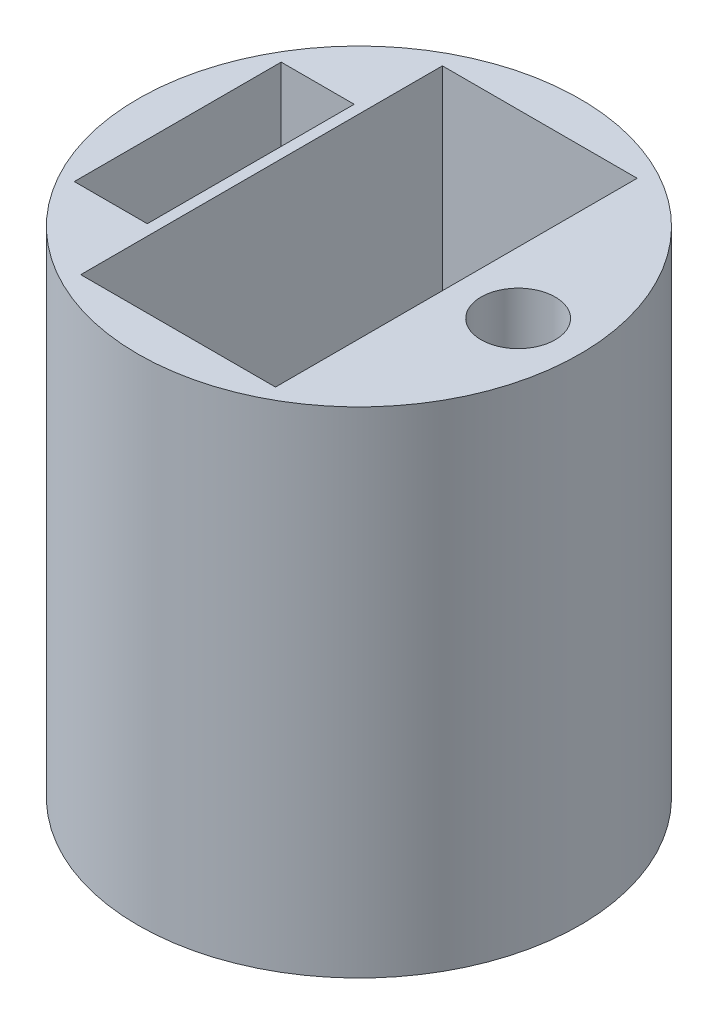
ISO-10303-21;
HEADER;
FILE_DESCRIPTION(('STEP AP214'),'2;1');
FILE_NAME('part.step','',(''),(''),'','','');
FILE_SCHEMA(('AUTOMOTIVE_DESIGN { 1 0 10303 214 1 1 1 1 }'));
ENDSEC;
DATA;
#1=APPLICATION_CONTEXT('core data for automotive mechanical design processes');
#2=APPLICATION_PROTOCOL_DEFINITION('international standard','automotive_design',2000,#1);
#3=PRODUCT_CONTEXT('',#1,'mechanical');
#4=PRODUCT('Part','Part','',(#3));
#5=PRODUCT_RELATED_PRODUCT_CATEGORY('part','',(#4));
#6=PRODUCT_DEFINITION_FORMATION('','',#4);
#7=PRODUCT_DEFINITION_CONTEXT('part definition',#1,'design');
#8=PRODUCT_DEFINITION('design','',#6,#7);
#9=PRODUCT_DEFINITION_SHAPE('','',#8);
#10=(LENGTH_UNIT() NAMED_UNIT(*) SI_UNIT(.MILLI.,.METRE.));
#11=(NAMED_UNIT(*) PLANE_ANGLE_UNIT() SI_UNIT($,.RADIAN.));
#12=(NAMED_UNIT(*) SI_UNIT($,.STERADIAN.) SOLID_ANGLE_UNIT());
#13=UNCERTAINTY_MEASURE_WITH_UNIT(LENGTH_MEASURE(1.E-05),#10,'distance_accuracy_value','');
#14=(GEOMETRIC_REPRESENTATION_CONTEXT(3) GLOBAL_UNCERTAINTY_ASSIGNED_CONTEXT((#13)) GLOBAL_UNIT_ASSIGNED_CONTEXT((#10,
#11,#12)) REPRESENTATION_CONTEXT('',''));
#15=CARTESIAN_POINT('',(0.,0.,0.));
#16=DIRECTION('',(0.,0.,1.));
#17=DIRECTION('',(1.,0.,0.));
#18=AXIS2_PLACEMENT_3D('',#15,#16,#17);
#19=CARTESIAN_POINT('',(0.,203.2,0.));
#20=DIRECTION('',(0.,-1.,0.));
#21=DIRECTION('',(0.,0.,-1.));
#22=AXIS2_PLACEMENT_3D('',#19,#20,#21);
#23=CYLINDRICAL_SURFACE('',#22,90.805);
#24=CARTESIAN_POINT('',(0.,203.2,0.));
#25=DIRECTION('',(0.,1.,0.));
#26=DIRECTION('',(0.,0.,1.));
#27=AXIS2_PLACEMENT_3D('',#24,#25,#26);
#28=CIRCLE('',#27,90.805);
#29=CARTESIAN_POINT('',(0.,203.2,90.805));
#30=VERTEX_POINT('',#29);
#31=EDGE_CURVE('E161',#30,#30,#28,.T.);
#32=ORIENTED_EDGE('',*,*,#31,.F.);
#33=EDGE_LOOP('',(#32));
#34=FACE_BOUND('',#33,.T.);
#35=CARTESIAN_POINT('',(0.,0.,0.));
#36=DIRECTION('',(0.,1.,0.));
#37=DIRECTION('',(0.,0.,1.));
#38=AXIS2_PLACEMENT_3D('',#35,#36,#37);
#39=CIRCLE('',#38,90.805);
#40=CARTESIAN_POINT('',(0.,0.,90.805));
#41=VERTEX_POINT('',#40);
#42=EDGE_CURVE('E154',#41,#41,#39,.T.);
#43=ORIENTED_EDGE('',*,*,#42,.T.);
#44=EDGE_LOOP('',(#43));
#45=FACE_BOUND('',#44,.T.);
#46=ADVANCED_FACE('F33',(#34,#45),#23,.T.);
#47=CARTESIAN_POINT('',(0.,203.2,0.));
#48=DIRECTION('',(0.,1.,0.));
#49=DIRECTION('',(0.,0.,1.));
#50=AXIS2_PLACEMENT_3D('',#47,#48,#49);
#51=PLANE('',#50);
#52=CARTESIAN_POINT('',(65.405,203.2,0.));
#53=DIRECTION('',(0.,1.,0.));
#54=DIRECTION('',(0.,0.,1.));
#55=AXIS2_PLACEMENT_3D('',#52,#53,#54);
#56=CIRCLE('',#55,15.24);
#57=CARTESIAN_POINT('',(65.405,203.2,15.24));
#58=VERTEX_POINT('',#57);
#59=EDGE_CURVE('E233',#58,#58,#56,.T.);
#60=ORIENTED_EDGE('',*,*,#59,.F.);
#61=EDGE_LOOP('',(#60));
#62=FACE_BOUND('',#61,.T.);
#63=DIRECTION('',(0.,0.,1.));
#64=VECTOR('',#63,1.);
#65=CARTESIAN_POINT('',(-74.45,203.2,-42.5));
#66=LINE('',#65,#64);
#67=CARTESIAN_POINT('',(-74.45,203.2,-42.5));
#68=VERTEX_POINT('',#67);
#69=CARTESIAN_POINT('',(-74.45,203.2,42.5));
#70=VERTEX_POINT('',#69);
#71=EDGE_CURVE('E54',#68,#70,#66,.T.);
#72=ORIENTED_EDGE('',*,*,#71,.F.);
#73=DIRECTION('',(-1.,0.,0.));
#74=VECTOR('',#73,1.);
#75=CARTESIAN_POINT('',(-74.45,203.2,-42.5));
#76=LINE('',#75,#74);
#77=CARTESIAN_POINT('',(-44.45,203.2,-42.5));
#78=VERTEX_POINT('',#77);
#79=EDGE_CURVE('E245',#78,#68,#76,.T.);
#80=ORIENTED_EDGE('',*,*,#79,.F.);
#81=DIRECTION('',(0.,0.,-1.));
#82=VECTOR('',#81,1.);
#83=CARTESIAN_POINT('',(-44.45,203.2,-42.5));
#84=LINE('',#83,#82);
#85=CARTESIAN_POINT('',(-44.45,203.2,42.5));
#86=VERTEX_POINT('',#85);
#87=EDGE_CURVE('E258',#86,#78,#84,.T.);
#88=ORIENTED_EDGE('',*,*,#87,.F.);
#89=DIRECTION('',(1.,0.,0.));
#90=VECTOR('',#89,1.);
#91=CARTESIAN_POINT('',(-74.45,203.2,42.5));
#92=LINE('',#91,#90);
#93=EDGE_CURVE('E255',#70,#86,#92,.T.);
#94=ORIENTED_EDGE('',*,*,#93,.F.);
#95=EDGE_LOOP('',(#72,#80,#88,#94));
#96=FACE_BOUND('',#95,.T.);
#97=DIRECTION('',(0.,0.,1.));
#98=VECTOR('',#97,1.);
#99=CARTESIAN_POINT('',(-40.005,203.2,-74.295));
#100=LINE('',#99,#98);
#101=CARTESIAN_POINT('',(-40.005,203.2,-74.295));
#102=VERTEX_POINT('',#101);
#103=CARTESIAN_POINT('',(-40.005,203.2,74.295));
#104=VERTEX_POINT('',#103);
#105=EDGE_CURVE('E141',#102,#104,#100,.T.);
#106=ORIENTED_EDGE('',*,*,#105,.F.);
#107=DIRECTION('',(-1.,0.,0.));
#108=VECTOR('',#107,1.);
#109=CARTESIAN_POINT('',(40.005,203.2,-74.295));
#110=LINE('',#109,#108);
#111=CARTESIAN_POINT('',(40.005,203.2,-74.295));
#112=VERTEX_POINT('',#111);
#113=EDGE_CURVE('E133',#112,#102,#110,.T.);
#114=ORIENTED_EDGE('',*,*,#113,.F.);
#115=DIRECTION('',(0.,0.,-1.));
#116=VECTOR('',#115,1.);
#117=CARTESIAN_POINT('',(40.005,203.2,-74.295));
#118=LINE('',#117,#116);
#119=CARTESIAN_POINT('',(40.005,203.2,74.295));
#120=VERTEX_POINT('',#119);
#121=EDGE_CURVE('E147',#120,#112,#118,.T.);
#122=ORIENTED_EDGE('',*,*,#121,.F.);
#123=DIRECTION('',(1.,0.,0.));
#124=VECTOR('',#123,1.);
#125=CARTESIAN_POINT('',(40.005,203.2,74.295));
#126=LINE('',#125,#124);
#127=EDGE_CURVE('E143',#104,#120,#126,.T.);
#128=ORIENTED_EDGE('',*,*,#127,.F.);
#129=EDGE_LOOP('',(#106,#114,#122,#128));
#130=FACE_BOUND('',#129,.T.);
#131=ORIENTED_EDGE('',*,*,#31,.T.);
#132=EDGE_LOOP('',(#131));
#133=FACE_BOUND('',#132,.T.);
#134=ADVANCED_FACE('F180',(#62,#96,#130,#133),#51,.T.);
#135=CARTESIAN_POINT('',(0.,0.,0.));
#136=DIRECTION('',(0.,1.,0.));
#137=DIRECTION('',(0.,0.,1.));
#138=AXIS2_PLACEMENT_3D('',#135,#136,#137);
#139=PLANE('',#138);
#140=CARTESIAN_POINT('',(65.405,0.,0.));
#141=DIRECTION('',(0.,1.,0.));
#142=DIRECTION('',(0.,0.,1.));
#143=AXIS2_PLACEMENT_3D('',#140,#141,#142);
#144=CIRCLE('',#143,15.24);
#145=CARTESIAN_POINT('',(65.405,0.,15.24));
#146=VERTEX_POINT('',#145);
#147=EDGE_CURVE('E236',#146,#146,#144,.F.);
#148=ORIENTED_EDGE('',*,*,#147,.F.);
#149=EDGE_LOOP('',(#148));
#150=FACE_BOUND('',#149,.T.);
#151=DIRECTION('',(0.,0.,1.));
#152=VECTOR('',#151,1.);
#153=CARTESIAN_POINT('',(-40.005,0.,-74.295));
#154=LINE('',#153,#152);
#155=CARTESIAN_POINT('',(-40.005,0.,-74.295));
#156=VERTEX_POINT('',#155);
#157=CARTESIAN_POINT('',(-40.005,0.,-3.98415720990258));
#158=VERTEX_POINT('',#157);
#159=EDGE_CURVE('E119',#156,#158,#154,.T.);
#160=ORIENTED_EDGE('',*,*,#159,.T.);
#161=CARTESIAN_POINT('',(-53.34,0.,3.39387606462255));
#162=DIRECTION('',(0.,-1.,0.));
#163=DIRECTION('',(0.,0.,-1.));
#164=AXIS2_PLACEMENT_3D('',#161,#162,#163);
#165=CIRCLE('',#164,15.24);
#166=CARTESIAN_POINT('',(-40.005,0.,10.7719093391477));
#167=VERTEX_POINT('',#166);
#168=EDGE_CURVE('E108',#167,#158,#165,.T.);
#169=ORIENTED_EDGE('',*,*,#168,.F.);
#170=CARTESIAN_POINT('',(-40.005,0.,74.295));
#171=VERTEX_POINT('',#170);
#172=EDGE_CURVE('E128',#167,#171,#154,.T.);
#173=ORIENTED_EDGE('',*,*,#172,.T.);
#174=DIRECTION('',(1.,0.,0.));
#175=VECTOR('',#174,1.);
#176=CARTESIAN_POINT('',(40.005,0.,74.295));
#177=LINE('',#176,#175);
#178=CARTESIAN_POINT('',(40.005,0.,74.295));
#179=VERTEX_POINT('',#178);
#180=EDGE_CURVE('E127',#171,#179,#177,.T.);
#181=ORIENTED_EDGE('',*,*,#180,.T.);
#182=DIRECTION('',(0.,0.,-1.));
#183=VECTOR('',#182,1.);
#184=CARTESIAN_POINT('',(40.005,0.,-74.295));
#185=LINE('',#184,#183);
#186=CARTESIAN_POINT('',(40.005,0.,-74.295));
#187=VERTEX_POINT('',#186);
#188=EDGE_CURVE('E131',#179,#187,#185,.T.);
#189=ORIENTED_EDGE('',*,*,#188,.T.);
#190=DIRECTION('',(-1.,0.,0.));
#191=VECTOR('',#190,1.);
#192=CARTESIAN_POINT('',(40.005,0.,-74.295));
#193=LINE('',#192,#191);
#194=EDGE_CURVE('E126',#187,#156,#193,.T.);
#195=ORIENTED_EDGE('',*,*,#194,.T.);
#196=EDGE_LOOP('',(#160,#169,#173,#181,#189,#195));
#197=FACE_BOUND('',#196,.T.);
#198=ORIENTED_EDGE('',*,*,#42,.F.);
#199=EDGE_LOOP('',(#198));
#200=FACE_BOUND('',#199,.T.);
#201=ADVANCED_FACE('F122',(#150,#197,#200),#139,.F.);
#202=CARTESIAN_POINT('',(-40.005,0.,-74.295));
#203=DIRECTION('',(-1.,0.,0.));
#204=DIRECTION('',(0.,0.,1.));
#205=AXIS2_PLACEMENT_3D('',#202,#203,#204);
#206=PLANE('',#205);
#207=DIRECTION('',(0.,0.,1.));
#208=VECTOR('',#207,1.);
#209=CARTESIAN_POINT('',(-40.005,63.5,-74.295));
#210=LINE('',#209,#208);
#211=CARTESIAN_POINT('',(-40.005,63.5,-3.98415720990258));
#212=VERTEX_POINT('',#211);
#213=CARTESIAN_POINT('',(-40.005,63.5,10.7719093391477));
#214=VERTEX_POINT('',#213);
#215=EDGE_CURVE('E121',#212,#214,#210,.T.);
#216=ORIENTED_EDGE('',*,*,#215,.F.);
#217=DIRECTION('',(0.,-1.,0.));
#218=VECTOR('',#217,1.);
#219=CARTESIAN_POINT('',(-40.005,63.5,-3.98415720990258));
#220=LINE('',#219,#218);
#221=EDGE_CURVE('E11',#212,#158,#220,.T.);
#222=ORIENTED_EDGE('',*,*,#221,.T.);
#223=ORIENTED_EDGE('',*,*,#159,.F.);
#224=DIRECTION('',(0.,1.,0.));
#225=VECTOR('',#224,1.);
#226=CARTESIAN_POINT('',(-40.005,0.,-74.295));
#227=LINE('',#226,#225);
#228=EDGE_CURVE('E152',#156,#102,#227,.T.);
#229=ORIENTED_EDGE('',*,*,#228,.T.);
#230=ORIENTED_EDGE('',*,*,#105,.T.);
#231=DIRECTION('',(0.,1.,0.));
#232=VECTOR('',#231,1.);
#233=CARTESIAN_POINT('',(-40.005,0.,74.295));
#234=LINE('',#233,#232);
#235=EDGE_CURVE('E140',#171,#104,#234,.T.);
#236=ORIENTED_EDGE('',*,*,#235,.F.);
#237=ORIENTED_EDGE('',*,*,#172,.F.);
#238=DIRECTION('',(0.,-1.,0.));
#239=VECTOR('',#238,1.);
#240=CARTESIAN_POINT('',(-40.005,63.5,10.7719093391477));
#241=LINE('',#240,#239);
#242=EDGE_CURVE('E40',#167,#214,#241,.F.);
#243=ORIENTED_EDGE('',*,*,#242,.T.);
#244=EDGE_LOOP('',(#216,#222,#223,#229,#230,#236,#237,#243));
#245=FACE_BOUND('',#244,.T.);
#246=ADVANCED_FACE('F118',(#245),#206,.F.);
#247=CARTESIAN_POINT('',(40.005,0.,-74.295));
#248=DIRECTION('',(0.,0.,-1.));
#249=DIRECTION('',(-1.,0.,0.));
#250=AXIS2_PLACEMENT_3D('',#247,#248,#249);
#251=PLANE('',#250);
#252=ORIENTED_EDGE('',*,*,#113,.T.);
#253=ORIENTED_EDGE('',*,*,#228,.F.);
#254=ORIENTED_EDGE('',*,*,#194,.F.);
#255=DIRECTION('',(0.,1.,0.));
#256=VECTOR('',#255,1.);
#257=CARTESIAN_POINT('',(40.005,0.,-74.295));
#258=LINE('',#257,#256);
#259=EDGE_CURVE('E155',#187,#112,#258,.T.);
#260=ORIENTED_EDGE('',*,*,#259,.T.);
#261=EDGE_LOOP('',(#252,#253,#254,#260));
#262=FACE_BOUND('',#261,.T.);
#263=ADVANCED_FACE('F177',(#262),#251,.F.);
#264=CARTESIAN_POINT('',(40.005,0.,-74.295));
#265=DIRECTION('',(1.,0.,0.));
#266=DIRECTION('',(0.,0.,-1.));
#267=AXIS2_PLACEMENT_3D('',#264,#265,#266);
#268=PLANE('',#267);
#269=ORIENTED_EDGE('',*,*,#121,.T.);
#270=ORIENTED_EDGE('',*,*,#259,.F.);
#271=ORIENTED_EDGE('',*,*,#188,.F.);
#272=DIRECTION('',(0.,1.,0.));
#273=VECTOR('',#272,1.);
#274=CARTESIAN_POINT('',(40.005,0.,74.295));
#275=LINE('',#274,#273);
#276=EDGE_CURVE('E157',#179,#120,#275,.T.);
#277=ORIENTED_EDGE('',*,*,#276,.T.);
#278=EDGE_LOOP('',(#269,#270,#271,#277));
#279=FACE_BOUND('',#278,.T.);
#280=ADVANCED_FACE('F174',(#279),#268,.F.);
#281=CARTESIAN_POINT('',(40.005,0.,74.295));
#282=DIRECTION('',(0.,0.,1.));
#283=DIRECTION('',(1.,0.,0.));
#284=AXIS2_PLACEMENT_3D('',#281,#282,#283);
#285=PLANE('',#284);
#286=ORIENTED_EDGE('',*,*,#127,.T.);
#287=ORIENTED_EDGE('',*,*,#276,.F.);
#288=ORIENTED_EDGE('',*,*,#180,.F.);
#289=ORIENTED_EDGE('',*,*,#235,.T.);
#290=EDGE_LOOP('',(#286,#287,#288,#289));
#291=FACE_BOUND('',#290,.T.);
#292=ADVANCED_FACE('F170',(#291),#285,.F.);
#293=CARTESIAN_POINT('',(-74.45,73.2,-42.5));
#294=DIRECTION('',(-1.,0.,0.));
#295=DIRECTION('',(0.,0.,1.));
#296=AXIS2_PLACEMENT_3D('',#293,#294,#295);
#297=PLANE('',#296);
#298=ORIENTED_EDGE('',*,*,#71,.T.);
#299=DIRECTION('',(0.,1.,0.));
#300=VECTOR('',#299,1.);
#301=CARTESIAN_POINT('',(-74.45,73.2,42.5));
#302=LINE('',#301,#300);
#303=CARTESIAN_POINT('',(-74.45,73.2,42.5));
#304=VERTEX_POINT('',#303);
#305=EDGE_CURVE('E135',#304,#70,#302,.T.);
#306=ORIENTED_EDGE('',*,*,#305,.F.);
#307=DIRECTION('',(0.,0.,1.));
#308=VECTOR('',#307,1.);
#309=CARTESIAN_POINT('',(-74.45,73.2,-42.5));
#310=LINE('',#309,#308);
#311=CARTESIAN_POINT('',(-74.45,73.2,-42.5));
#312=VERTEX_POINT('',#311);
#313=EDGE_CURVE('E241',#312,#304,#310,.T.);
#314=ORIENTED_EDGE('',*,*,#313,.F.);
#315=DIRECTION('',(0.,1.,0.));
#316=VECTOR('',#315,1.);
#317=CARTESIAN_POINT('',(-74.45,73.2,-42.5));
#318=LINE('',#317,#316);
#319=EDGE_CURVE('E144',#312,#68,#318,.T.);
#320=ORIENTED_EDGE('',*,*,#319,.T.);
#321=EDGE_LOOP('',(#298,#306,#314,#320));
#322=FACE_BOUND('',#321,.T.);
#323=ADVANCED_FACE('F200',(#322),#297,.F.);
#324=CARTESIAN_POINT('',(-74.45,73.2,-42.5));
#325=DIRECTION('',(0.,0.,-1.));
#326=DIRECTION('',(-1.,0.,0.));
#327=AXIS2_PLACEMENT_3D('',#324,#325,#326);
#328=PLANE('',#327);
#329=ORIENTED_EDGE('',*,*,#79,.T.);
#330=ORIENTED_EDGE('',*,*,#319,.F.);
#331=DIRECTION('',(-1.,0.,0.));
#332=VECTOR('',#331,1.);
#333=CARTESIAN_POINT('',(-74.45,73.2,-42.5));
#334=LINE('',#333,#332);
#335=CARTESIAN_POINT('',(-44.45,73.2,-42.5));
#336=VERTEX_POINT('',#335);
#337=EDGE_CURVE('E251',#336,#312,#334,.T.);
#338=ORIENTED_EDGE('',*,*,#337,.F.);
#339=DIRECTION('',(0.,1.,0.));
#340=VECTOR('',#339,1.);
#341=CARTESIAN_POINT('',(-44.45,73.2,-42.5));
#342=LINE('',#341,#340);
#343=EDGE_CURVE('E264',#336,#78,#342,.T.);
#344=ORIENTED_EDGE('',*,*,#343,.T.);
#345=EDGE_LOOP('',(#329,#330,#338,#344));
#346=FACE_BOUND('',#345,.T.);
#347=ADVANCED_FACE('F207',(#346),#328,.F.);
#348=CARTESIAN_POINT('',(-44.45,73.2,-42.5));
#349=DIRECTION('',(1.,0.,0.));
#350=DIRECTION('',(0.,0.,-1.));
#351=AXIS2_PLACEMENT_3D('',#348,#349,#350);
#352=PLANE('',#351);
#353=ORIENTED_EDGE('',*,*,#87,.T.);
#354=ORIENTED_EDGE('',*,*,#343,.F.);
#355=DIRECTION('',(0.,0.,-1.));
#356=VECTOR('',#355,1.);
#357=CARTESIAN_POINT('',(-44.45,73.2,-42.5));
#358=LINE('',#357,#356);
#359=CARTESIAN_POINT('',(-44.45,73.2,42.5));
#360=VERTEX_POINT('',#359);
#361=EDGE_CURVE('E248',#360,#336,#358,.T.);
#362=ORIENTED_EDGE('',*,*,#361,.F.);
#363=DIRECTION('',(0.,1.,0.));
#364=VECTOR('',#363,1.);
#365=CARTESIAN_POINT('',(-44.45,73.2,42.5));
#366=LINE('',#365,#364);
#367=EDGE_CURVE('E265',#360,#86,#366,.T.);
#368=ORIENTED_EDGE('',*,*,#367,.T.);
#369=EDGE_LOOP('',(#353,#354,#362,#368));
#370=FACE_BOUND('',#369,.T.);
#371=ADVANCED_FACE('F212',(#370),#352,.F.);
#372=CARTESIAN_POINT('',(-74.45,73.2,42.5));
#373=DIRECTION('',(0.,0.,1.));
#374=DIRECTION('',(1.,0.,0.));
#375=AXIS2_PLACEMENT_3D('',#372,#373,#374);
#376=PLANE('',#375);
#377=ORIENTED_EDGE('',*,*,#93,.T.);
#378=ORIENTED_EDGE('',*,*,#367,.F.);
#379=DIRECTION('',(1.,0.,0.));
#380=VECTOR('',#379,1.);
#381=CARTESIAN_POINT('',(-74.45,73.2,42.5));
#382=LINE('',#381,#380);
#383=EDGE_CURVE('E244',#304,#360,#382,.T.);
#384=ORIENTED_EDGE('',*,*,#383,.F.);
#385=ORIENTED_EDGE('',*,*,#305,.T.);
#386=EDGE_LOOP('',(#377,#378,#384,#385));
#387=FACE_BOUND('',#386,.T.);
#388=ADVANCED_FACE('F208',(#387),#376,.F.);
#389=CARTESIAN_POINT('',(0.,73.2,0.));
#390=DIRECTION('',(0.,1.,0.));
#391=DIRECTION('',(0.,0.,1.));
#392=AXIS2_PLACEMENT_3D('',#389,#390,#391);
#393=PLANE('',#392);
#394=ORIENTED_EDGE('',*,*,#313,.T.);
#395=ORIENTED_EDGE('',*,*,#383,.T.);
#396=ORIENTED_EDGE('',*,*,#361,.T.);
#397=ORIENTED_EDGE('',*,*,#337,.T.);
#398=EDGE_LOOP('',(#394,#395,#396,#397));
#399=FACE_BOUND('',#398,.T.);
#400=ADVANCED_FACE('F211',(#399),#393,.T.);
#401=CARTESIAN_POINT('',(65.405,-43.1052293811319,0.));
#402=DIRECTION('',(0.,1.,0.));
#403=DIRECTION('',(0.,0.,1.));
#404=AXIS2_PLACEMENT_3D('',#401,#402,#403);
#405=CYLINDRICAL_SURFACE('',#404,15.24);
#406=CARTESIAN_POINT('',(65.405,0.,15.24));
#407=CARTESIAN_POINT('',(65.405,2.11666666666666,15.24));
#408=CARTESIAN_POINT('',(65.405,4.23333333333333,15.24));
#409=CARTESIAN_POINT('',(65.405,8.46666666666666,15.24));
#410=CARTESIAN_POINT('',(65.405,10.5833333333333,15.24));
#411=CARTESIAN_POINT('',(65.405,14.8166666666667,15.24));
#412=CARTESIAN_POINT('',(65.405,16.9333333333333,15.24));
#413=CARTESIAN_POINT('',(65.405,21.1666666666667,15.24));
#414=CARTESIAN_POINT('',(65.405,23.2833333333333,15.24));
#415=CARTESIAN_POINT('',(65.405,27.5166666666667,15.24));
#416=CARTESIAN_POINT('',(65.405,29.6333333333333,15.24));
#417=CARTESIAN_POINT('',(65.405,33.8666666666666,15.24));
#418=CARTESIAN_POINT('',(65.405,35.9833333333333,15.24));
#419=CARTESIAN_POINT('',(65.405,40.2166666666666,15.24));
#420=CARTESIAN_POINT('',(65.405,42.3333333333333,15.24));
#421=CARTESIAN_POINT('',(65.405,46.5666666666666,15.24));
#422=CARTESIAN_POINT('',(65.405,48.6833333333333,15.24));
#423=CARTESIAN_POINT('',(65.405,52.9166666666667,15.24));
#424=CARTESIAN_POINT('',(65.405,55.0333333333333,15.24));
#425=CARTESIAN_POINT('',(65.405,59.2666666666667,15.24));
#426=CARTESIAN_POINT('',(65.405,61.3833333333333,15.24));
#427=CARTESIAN_POINT('',(65.405,65.6166666666667,15.24));
#428=CARTESIAN_POINT('',(65.405,67.7333333333333,15.24));
#429=CARTESIAN_POINT('',(65.405,71.9666666666667,15.24));
#430=CARTESIAN_POINT('',(65.405,74.0833333333333,15.24));
#431=CARTESIAN_POINT('',(65.405,78.3166666666666,15.24));
#432=CARTESIAN_POINT('',(65.405,80.4333333333333,15.24));
#433=CARTESIAN_POINT('',(65.405,84.6666666666666,15.24));
#434=CARTESIAN_POINT('',(65.405,86.7833333333333,15.24));
#435=CARTESIAN_POINT('',(65.405,91.0166666666666,15.24));
#436=CARTESIAN_POINT('',(65.405,93.1333333333333,15.24));
#437=CARTESIAN_POINT('',(65.405,97.3666666666666,15.24));
#438=CARTESIAN_POINT('',(65.405,99.4833333333333,15.24));
#439=CARTESIAN_POINT('',(65.405,103.716666666667,15.24));
#440=CARTESIAN_POINT('',(65.405,105.833333333333,15.24));
#441=CARTESIAN_POINT('',(65.405,110.066666666667,15.24));
#442=CARTESIAN_POINT('',(65.405,112.183333333333,15.24));
#443=CARTESIAN_POINT('',(65.405,116.416666666667,15.24));
#444=CARTESIAN_POINT('',(65.405,118.533333333333,15.24));
#445=CARTESIAN_POINT('',(65.405,122.766666666667,15.24));
#446=CARTESIAN_POINT('',(65.405,124.883333333333,15.24));
#447=CARTESIAN_POINT('',(65.405,129.116666666667,15.24));
#448=CARTESIAN_POINT('',(65.405,131.233333333333,15.24));
#449=CARTESIAN_POINT('',(65.405,135.466666666667,15.24));
#450=CARTESIAN_POINT('',(65.405,137.583333333333,15.24));
#451=CARTESIAN_POINT('',(65.405,141.816666666667,15.24));
#452=CARTESIAN_POINT('',(65.405,143.933333333333,15.24));
#453=CARTESIAN_POINT('',(65.405,148.166666666667,15.24));
#454=CARTESIAN_POINT('',(65.405,150.283333333333,15.24));
#455=CARTESIAN_POINT('',(65.405,154.516666666667,15.24));
#456=CARTESIAN_POINT('',(65.405,156.633333333333,15.24));
#457=CARTESIAN_POINT('',(65.405,160.866666666667,15.24));
#458=CARTESIAN_POINT('',(65.405,162.983333333333,15.24));
#459=CARTESIAN_POINT('',(65.405,167.216666666667,15.24));
#460=CARTESIAN_POINT('',(65.405,169.333333333333,15.24));
#461=CARTESIAN_POINT('',(65.405,173.566666666667,15.24));
#462=CARTESIAN_POINT('',(65.405,175.683333333333,15.24));
#463=CARTESIAN_POINT('',(65.405,179.916666666667,15.24));
#464=CARTESIAN_POINT('',(65.405,182.033333333333,15.24));
#465=CARTESIAN_POINT('',(65.405,186.266666666667,15.24));
#466=CARTESIAN_POINT('',(65.405,188.383333333333,15.24));
#467=CARTESIAN_POINT('',(65.405,192.616666666667,15.24));
#468=CARTESIAN_POINT('',(65.405,194.733333333333,15.24));
#469=CARTESIAN_POINT('',(65.405,198.966666666667,15.24));
#470=CARTESIAN_POINT('',(65.405,201.083333333333,15.24));
#471=CARTESIAN_POINT('',(65.405,203.2,15.24));
#472=B_SPLINE_CURVE_WITH_KNOTS('',3,(#406,#407,#408,#409,#410,#411,#412,#413,#414,#415,#416,
#417,#418,#419,#420,#421,#422,#423,#424,#425,#426,#427,#428,#429,#430,#431,#432,#433,#434,#435,
#436,#437,#438,#439,#440,#441,#442,#443,#444,#445,#446,#447,#448,#449,#450,#451,#452,#453,#454,
#455,#456,#457,#458,#459,#460,#461,#462,#463,#464,#465,#466,#467,#468,#469,#470,#471),
.UNSPECIFIED.,.F.,.F.,(4,2,2,2,2,2,2,2,2,2,2,2,2,2,2,2,2,2,2,2,2,2,2,2,2,2,2,2,2,2,2,2,4),(0.,
6.35,12.7,19.05,25.4,31.75,38.1,44.45,50.8,57.15,63.5,69.85,76.2,82.55,88.9,95.25,101.6,107.95,
114.3,120.65,127.,133.35,139.7,146.05,152.4,158.75,165.1,171.45,177.8,184.15,190.5,196.85,
203.2),.UNSPECIFIED.);
#473=EDGE_CURVE('BSEAM222',#146,#58,#472,.T.);
#474=ORIENTED_EDGE('',*,*,#147,.T.);
#475=ORIENTED_EDGE('',*,*,#59,.T.);
#476=ORIENTED_EDGE('',*,*,#473,.T.);
#477=ORIENTED_EDGE('',*,*,#473,.F.);
#478=EDGE_LOOP('',(#474,#476,#475,#477));
#479=FACE_BOUND('',#478,.T.);
#480=ADVANCED_FACE('F222',(#479),#405,.F.);
#481=CARTESIAN_POINT('',(-53.34,63.5,3.39387606462255));
#482=DIRECTION('',(0.,-1.,0.));
#483=DIRECTION('',(0.,0.,-1.));
#484=AXIS2_PLACEMENT_3D('',#481,#482,#483);
#485=CYLINDRICAL_SURFACE('',#484,15.24);
#486=CARTESIAN_POINT('',(-53.34,63.5,3.39387606462255));
#487=DIRECTION('',(0.,-1.,0.));
#488=DIRECTION('',(0.,0.,-1.));
#489=AXIS2_PLACEMENT_3D('',#486,#487,#488);
#490=CIRCLE('',#489,15.24);
#491=EDGE_CURVE('E46',#214,#212,#490,.T.);
#492=ORIENTED_EDGE('',*,*,#491,.F.);
#493=ORIENTED_EDGE('',*,*,#242,.F.);
#494=ORIENTED_EDGE('',*,*,#168,.T.);
#495=ORIENTED_EDGE('',*,*,#221,.F.);
#496=EDGE_LOOP('',(#492,#493,#494,#495));
#497=FACE_BOUND('',#496,.T.);
#498=ADVANCED_FACE('F109',(#497),#485,.F.);
#499=CARTESIAN_POINT('',(-53.34,63.5,3.39387606462255));
#500=DIRECTION('',(0.,-1.,0.));
#501=DIRECTION('',(0.,0.,-1.));
#502=AXIS2_PLACEMENT_3D('',#499,#500,#501);
#503=PLANE('',#502);
#504=ORIENTED_EDGE('',*,*,#215,.T.);
#505=ORIENTED_EDGE('',*,*,#491,.T.);
#506=EDGE_LOOP('',(#504,#505));
#507=FACE_BOUND('',#506,.T.);
#508=ADVANCED_FACE('F229',(#507),#503,.T.);
#509=CLOSED_SHELL('',(#46,#134,#201,#246,#263,#280,#292,#323,#347,#371,#388,#400,#480,#498,#508));
#510=MANIFOLD_SOLID_BREP('B2',#509);
#511=ADVANCED_BREP_SHAPE_REPRESENTATION('',(#18,#510),#14);
#512=SHAPE_DEFINITION_REPRESENTATION(#9,#511);
ENDSEC;
END-ISO-10303-21;
